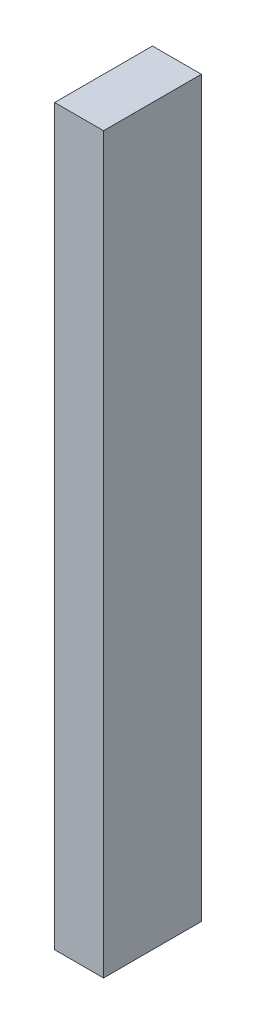
ISO-10303-21;
HEADER;
FILE_DESCRIPTION(('STEP AP214'),'2;1');
FILE_NAME('part.step','',(''),(''),'','','');
FILE_SCHEMA(('AUTOMOTIVE_DESIGN { 1 0 10303 214 1 1 1 1 }'));
ENDSEC;
DATA;
#1=APPLICATION_CONTEXT('core data for automotive mechanical design processes');
#2=APPLICATION_PROTOCOL_DEFINITION('international standard','automotive_design',2000,#1);
#3=PRODUCT_CONTEXT('',#1,'mechanical');
#4=PRODUCT('Part','Part','',(#3));
#5=PRODUCT_RELATED_PRODUCT_CATEGORY('part','',(#4));
#6=PRODUCT_DEFINITION_FORMATION('','',#4);
#7=PRODUCT_DEFINITION_CONTEXT('part definition',#1,'design');
#8=PRODUCT_DEFINITION('design','',#6,#7);
#9=PRODUCT_DEFINITION_SHAPE('','',#8);
#10=(LENGTH_UNIT() NAMED_UNIT(*) SI_UNIT(.MILLI.,.METRE.));
#11=(NAMED_UNIT(*) PLANE_ANGLE_UNIT() SI_UNIT($,.RADIAN.));
#12=(NAMED_UNIT(*) SI_UNIT($,.STERADIAN.) SOLID_ANGLE_UNIT());
#13=UNCERTAINTY_MEASURE_WITH_UNIT(LENGTH_MEASURE(1.E-05),#10,'distance_accuracy_value','');
#14=(GEOMETRIC_REPRESENTATION_CONTEXT(3) GLOBAL_UNCERTAINTY_ASSIGNED_CONTEXT((#13)) GLOBAL_UNIT_ASSIGNED_CONTEXT((#10,
#11,#12)) REPRESENTATION_CONTEXT('',''));
#15=CARTESIAN_POINT('',(0.,0.,0.));
#16=DIRECTION('',(0.,0.,1.));
#17=DIRECTION('',(1.,0.,0.));
#18=AXIS2_PLACEMENT_3D('',#15,#16,#17);
#19=CARTESIAN_POINT('',(0.,762.,0.));
#20=DIRECTION('',(1.,0.,0.));
#21=DIRECTION('',(0.,0.,-1.));
#22=AXIS2_PLACEMENT_3D('',#19,#20,#21);
#23=PLANE('',#22);
#24=DIRECTION('',(0.,0.,1.));
#25=VECTOR('',#24,1.);
#26=CARTESIAN_POINT('',(0.,0.,0.));
#27=LINE('',#26,#25);
#28=CARTESIAN_POINT('',(0.,0.,-101.6));
#29=VERTEX_POINT('',#28);
#30=CARTESIAN_POINT('',(0.,0.,0.));
#31=VERTEX_POINT('',#30);
#32=EDGE_CURVE('E107',#29,#31,#27,.T.);
#33=ORIENTED_EDGE('',*,*,#32,.T.);
#34=DIRECTION('',(0.,-1.,0.));
#35=VECTOR('',#34,1.);
#36=CARTESIAN_POINT('',(0.,762.,0.));
#37=LINE('',#36,#35);
#38=CARTESIAN_POINT('',(0.,762.,0.));
#39=VERTEX_POINT('',#38);
#40=EDGE_CURVE('E11',#39,#31,#37,.T.);
#41=ORIENTED_EDGE('',*,*,#40,.F.);
#42=DIRECTION('',(0.,0.,1.));
#43=VECTOR('',#42,1.);
#44=CARTESIAN_POINT('',(0.,762.,0.));
#45=LINE('',#44,#43);
#46=CARTESIAN_POINT('',(0.,762.,-101.6));
#47=VERTEX_POINT('',#46);
#48=EDGE_CURVE('E91',#47,#39,#45,.T.);
#49=ORIENTED_EDGE('',*,*,#48,.F.);
#50=DIRECTION('',(0.,-1.,0.));
#51=VECTOR('',#50,1.);
#52=CARTESIAN_POINT('',(0.,762.,-101.6));
#53=LINE('',#52,#51);
#54=EDGE_CURVE('E103',#47,#29,#53,.T.);
#55=ORIENTED_EDGE('',*,*,#54,.T.);
#56=EDGE_LOOP('',(#33,#41,#49,#55));
#57=FACE_BOUND('',#56,.T.);
#58=ADVANCED_FACE('F39',(#57),#23,.F.);
#59=CARTESIAN_POINT('',(0.,762.,0.));
#60=DIRECTION('',(0.,0.,-1.));
#61=DIRECTION('',(-1.,0.,0.));
#62=AXIS2_PLACEMENT_3D('',#59,#60,#61);
#63=PLANE('',#62);
#64=DIRECTION('',(1.,0.,0.));
#65=VECTOR('',#64,1.);
#66=CARTESIAN_POINT('',(0.,0.,0.));
#67=LINE('',#66,#65);
#68=CARTESIAN_POINT('',(50.8,0.,0.));
#69=VERTEX_POINT('',#68);
#70=EDGE_CURVE('E96',#31,#69,#67,.T.);
#71=ORIENTED_EDGE('',*,*,#70,.T.);
#72=DIRECTION('',(0.,-1.,0.));
#73=VECTOR('',#72,1.);
#74=CARTESIAN_POINT('',(50.8,762.,0.));
#75=LINE('',#74,#73);
#76=CARTESIAN_POINT('',(50.8,762.,0.));
#77=VERTEX_POINT('',#76);
#78=EDGE_CURVE('E48',#77,#69,#75,.T.);
#79=ORIENTED_EDGE('',*,*,#78,.F.);
#80=DIRECTION('',(1.,0.,0.));
#81=VECTOR('',#80,1.);
#82=CARTESIAN_POINT('',(0.,762.,0.));
#83=LINE('',#82,#81);
#84=EDGE_CURVE('E86',#39,#77,#83,.T.);
#85=ORIENTED_EDGE('',*,*,#84,.F.);
#86=ORIENTED_EDGE('',*,*,#40,.T.);
#87=EDGE_LOOP('',(#71,#79,#85,#86));
#88=FACE_BOUND('',#87,.T.);
#89=ADVANCED_FACE('F95',(#88),#63,.F.);
#90=CARTESIAN_POINT('',(50.8,762.,0.));
#91=DIRECTION('',(-1.,0.,0.));
#92=DIRECTION('',(0.,0.,1.));
#93=AXIS2_PLACEMENT_3D('',#90,#91,#92);
#94=PLANE('',#93);
#95=DIRECTION('',(0.,0.,-1.));
#96=VECTOR('',#95,1.);
#97=CARTESIAN_POINT('',(50.8,0.,0.));
#98=LINE('',#97,#96);
#99=CARTESIAN_POINT('',(50.8,0.,-101.6));
#100=VERTEX_POINT('',#99);
#101=EDGE_CURVE('E73',#69,#100,#98,.T.);
#102=ORIENTED_EDGE('',*,*,#101,.T.);
#103=DIRECTION('',(0.,-1.,0.));
#104=VECTOR('',#103,1.);
#105=CARTESIAN_POINT('',(50.8,762.,-101.6));
#106=LINE('',#105,#104);
#107=CARTESIAN_POINT('',(50.8,762.,-101.6));
#108=VERTEX_POINT('',#107);
#109=EDGE_CURVE('E98',#108,#100,#106,.T.);
#110=ORIENTED_EDGE('',*,*,#109,.F.);
#111=DIRECTION('',(0.,0.,-1.));
#112=VECTOR('',#111,1.);
#113=CARTESIAN_POINT('',(50.8,762.,0.));
#114=LINE('',#113,#112);
#115=EDGE_CURVE('E89',#77,#108,#114,.T.);
#116=ORIENTED_EDGE('',*,*,#115,.F.);
#117=ORIENTED_EDGE('',*,*,#78,.T.);
#118=EDGE_LOOP('',(#102,#110,#116,#117));
#119=FACE_BOUND('',#118,.T.);
#120=ADVANCED_FACE('F99',(#119),#94,.F.);
#121=CARTESIAN_POINT('',(0.,762.,-101.6));
#122=DIRECTION('',(0.,0.,1.));
#123=DIRECTION('',(1.,0.,0.));
#124=AXIS2_PLACEMENT_3D('',#121,#122,#123);
#125=PLANE('',#124);
#126=DIRECTION('',(-1.,0.,0.));
#127=VECTOR('',#126,1.);
#128=CARTESIAN_POINT('',(0.,0.,-101.6));
#129=LINE('',#128,#127);
#130=EDGE_CURVE('E79',#100,#29,#129,.T.);
#131=ORIENTED_EDGE('',*,*,#130,.T.);
#132=ORIENTED_EDGE('',*,*,#54,.F.);
#133=DIRECTION('',(-1.,0.,0.));
#134=VECTOR('',#133,1.);
#135=CARTESIAN_POINT('',(0.,762.,-101.6));
#136=LINE('',#135,#134);
#137=EDGE_CURVE('E56',#108,#47,#136,.T.);
#138=ORIENTED_EDGE('',*,*,#137,.F.);
#139=ORIENTED_EDGE('',*,*,#109,.T.);
#140=EDGE_LOOP('',(#131,#132,#138,#139));
#141=FACE_BOUND('',#140,.T.);
#142=ADVANCED_FACE('F120',(#141),#125,.F.);
#143=CARTESIAN_POINT('',(0.,762.,0.));
#144=DIRECTION('',(0.,-1.,0.));
#145=DIRECTION('',(0.,0.,-1.));
#146=AXIS2_PLACEMENT_3D('',#143,#144,#145);
#147=PLANE('',#146);
#148=ORIENTED_EDGE('',*,*,#48,.T.);
#149=ORIENTED_EDGE('',*,*,#84,.T.);
#150=ORIENTED_EDGE('',*,*,#115,.T.);
#151=ORIENTED_EDGE('',*,*,#137,.T.);
#152=EDGE_LOOP('',(#148,#149,#150,#151));
#153=FACE_BOUND('',#152,.T.);
#154=ADVANCED_FACE('F87',(#153),#147,.F.);
#155=CARTESIAN_POINT('',(0.,0.,0.));
#156=DIRECTION('',(0.,-1.,0.));
#157=DIRECTION('',(0.,0.,-1.));
#158=AXIS2_PLACEMENT_3D('',#155,#156,#157);
#159=PLANE('',#158);
#160=ORIENTED_EDGE('',*,*,#32,.F.);
#161=ORIENTED_EDGE('',*,*,#130,.F.);
#162=ORIENTED_EDGE('',*,*,#101,.F.);
#163=ORIENTED_EDGE('',*,*,#70,.F.);
#164=EDGE_LOOP('',(#160,#161,#162,#163));
#165=FACE_BOUND('',#164,.T.);
#166=ADVANCED_FACE('F123',(#165),#159,.T.);
#167=CLOSED_SHELL('',(#58,#89,#120,#142,#154,#166));
#168=MANIFOLD_SOLID_BREP('B2',#167);
#169=ADVANCED_BREP_SHAPE_REPRESENTATION('',(#18,#168),#14);
#170=SHAPE_DEFINITION_REPRESENTATION(#9,#169);
ENDSEC;
END-ISO-10303-21;
